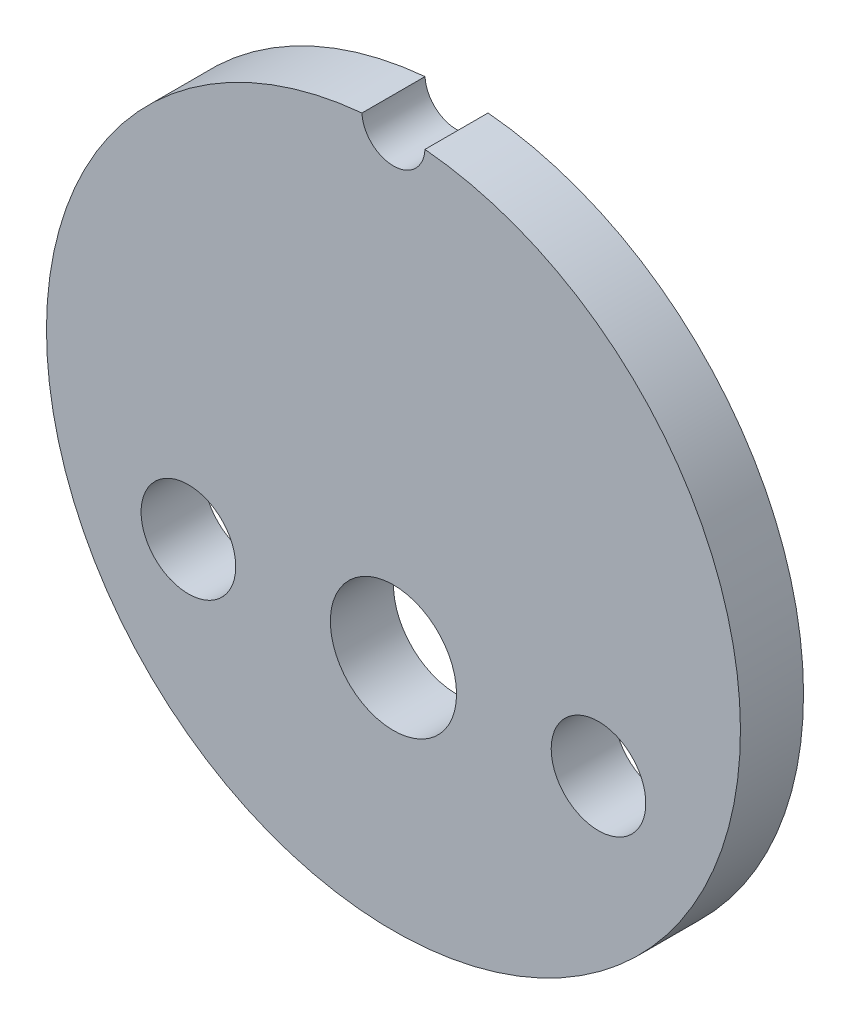
ISO-10303-21;
HEADER;
FILE_DESCRIPTION(('STEP AP214'),'2;1');
FILE_NAME('part.step','',(''),(''),'','','');
FILE_SCHEMA(('AUTOMOTIVE_DESIGN { 1 0 10303 214 1 1 1 1 }'));
ENDSEC;
DATA;
#1=APPLICATION_CONTEXT('core data for automotive mechanical design processes');
#2=APPLICATION_PROTOCOL_DEFINITION('international standard','automotive_design',2000,#1);
#3=PRODUCT_CONTEXT('',#1,'mechanical');
#4=PRODUCT('Part','Part','',(#3));
#5=PRODUCT_RELATED_PRODUCT_CATEGORY('part','',(#4));
#6=PRODUCT_DEFINITION_FORMATION('','',#4);
#7=PRODUCT_DEFINITION_CONTEXT('part definition',#1,'design');
#8=PRODUCT_DEFINITION('design','',#6,#7);
#9=PRODUCT_DEFINITION_SHAPE('','',#8);
#10=(LENGTH_UNIT() NAMED_UNIT(*) SI_UNIT(.MILLI.,.METRE.));
#11=(NAMED_UNIT(*) PLANE_ANGLE_UNIT() SI_UNIT($,.RADIAN.));
#12=(NAMED_UNIT(*) SI_UNIT($,.STERADIAN.) SOLID_ANGLE_UNIT());
#13=UNCERTAINTY_MEASURE_WITH_UNIT(LENGTH_MEASURE(1.E-05),#10,'distance_accuracy_value','');
#14=(GEOMETRIC_REPRESENTATION_CONTEXT(3) GLOBAL_UNCERTAINTY_ASSIGNED_CONTEXT((#13)) GLOBAL_UNIT_ASSIGNED_CONTEXT((#10,
#11,#12)) REPRESENTATION_CONTEXT('',''));
#15=CARTESIAN_POINT('',(0.,0.,0.));
#16=DIRECTION('',(0.,0.,1.));
#17=DIRECTION('',(1.,0.,0.));
#18=AXIS2_PLACEMENT_3D('',#15,#16,#17);
#19=CARTESIAN_POINT('',(-0.589945762939997,5.34282561400124,2.));
#20=DIRECTION('',(0.,0.,1.));
#21=DIRECTION('',(1.,0.,0.));
#22=AXIS2_PLACEMENT_3D('',#19,#20,#21);
#23=PLANE('',#22);
#24=CARTESIAN_POINT('',(-0.589945762939997,16.3428256140012,2.));
#25=DIRECTION('',(0.,0.,1.));
#26=DIRECTION('',(1.,0.,0.));
#27=AXIS2_PLACEMENT_3D('',#24,#25,#26);
#28=CIRCLE('',#27,1.);
#29=CARTESIAN_POINT('',(-1.58891217093254,16.2973710685467,2.));
#30=VERTEX_POINT('',#29);
#31=CARTESIAN_POINT('',(0.409020645052558,16.2973710685467,2.));
#32=VERTEX_POINT('',#31);
#33=EDGE_CURVE('E59',#30,#32,#28,.T.);
#34=ORIENTED_EDGE('',*,*,#33,.F.);
#35=CARTESIAN_POINT('',(-0.589945762939997,5.34282561400124,2.));
#36=DIRECTION('',(0.,0.,1.));
#37=DIRECTION('',(1.,0.,0.));
#38=AXIS2_PLACEMENT_3D('',#35,#36,#37);
#39=CIRCLE('',#38,11.);
#40=EDGE_CURVE('E76',#30,#32,#39,.T.);
#41=ORIENTED_EDGE('',*,*,#40,.T.);
#42=EDGE_LOOP('',(#34,#41));
#43=FACE_BOUND('',#42,.T.);
#44=CARTESIAN_POINT('',(5.91005423706,1.84282561400124,2.));
#45=DIRECTION('',(0.,0.,1.));
#46=DIRECTION('',(-1.,0.,0.));
#47=AXIS2_PLACEMENT_3D('',#44,#45,#46);
#48=CIRCLE('',#47,1.5);
#49=CARTESIAN_POINT('',(4.41005423706,1.84282561400124,2.));
#50=VERTEX_POINT('',#49);
#51=EDGE_CURVE('E89',#50,#50,#48,.T.);
#52=ORIENTED_EDGE('',*,*,#51,.F.);
#53=EDGE_LOOP('',(#52));
#54=FACE_BOUND('',#53,.T.);
#55=CARTESIAN_POINT('',(-7.08994576294,1.84282561400124,2.));
#56=DIRECTION('',(0.,0.,1.));
#57=DIRECTION('',(1.,0.,0.));
#58=AXIS2_PLACEMENT_3D('',#55,#56,#57);
#59=CIRCLE('',#58,1.5);
#60=CARTESIAN_POINT('',(-5.58994576294,1.84282561400124,2.));
#61=VERTEX_POINT('',#60);
#62=EDGE_CURVE('E77',#61,#61,#59,.T.);
#63=ORIENTED_EDGE('',*,*,#62,.F.);
#64=EDGE_LOOP('',(#63));
#65=FACE_BOUND('',#64,.T.);
#66=CARTESIAN_POINT('',(-0.589945762939997,1.84282561400124,2.));
#67=DIRECTION('',(0.,0.,1.));
#68=DIRECTION('',(1.,0.,0.));
#69=AXIS2_PLACEMENT_3D('',#66,#67,#68);
#70=CIRCLE('',#69,2.);
#71=CARTESIAN_POINT('',(1.41005423706,1.84282561400124,2.));
#72=VERTEX_POINT('',#71);
#73=EDGE_CURVE('E95',#72,#72,#70,.T.);
#74=ORIENTED_EDGE('',*,*,#73,.F.);
#75=EDGE_LOOP('',(#74));
#76=FACE_BOUND('',#75,.T.);
#77=ADVANCED_FACE('F38',(#43,#54,#65,#76),#23,.T.);
#78=CARTESIAN_POINT('',(-0.589945762939997,5.34282561400124,0.));
#79=DIRECTION('',(0.,0.,1.));
#80=DIRECTION('',(1.,0.,0.));
#81=AXIS2_PLACEMENT_3D('',#78,#79,#80);
#82=PLANE('',#81);
#83=CARTESIAN_POINT('',(-0.589945762939997,5.34282561400124,0.));
#84=DIRECTION('',(0.,0.,1.));
#85=DIRECTION('',(1.,0.,0.));
#86=AXIS2_PLACEMENT_3D('',#83,#84,#85);
#87=CIRCLE('',#86,11.);
#88=CARTESIAN_POINT('',(-1.58891217093254,16.2973710685467,0.));
#89=VERTEX_POINT('',#88);
#90=CARTESIAN_POINT('',(0.409020645052544,16.2973710685467,0.));
#91=VERTEX_POINT('',#90);
#92=EDGE_CURVE('E72',#89,#91,#87,.T.);
#93=ORIENTED_EDGE('',*,*,#92,.F.);
#94=CARTESIAN_POINT('',(-0.589945762939997,16.3428256140012,0.));
#95=DIRECTION('',(0.,0.,-1.));
#96=DIRECTION('',(-1.,0.,0.));
#97=AXIS2_PLACEMENT_3D('',#94,#95,#96);
#98=CIRCLE('',#97,1.);
#99=EDGE_CURVE('E54',#91,#89,#98,.T.);
#100=ORIENTED_EDGE('',*,*,#99,.F.);
#101=EDGE_LOOP('',(#93,#100));
#102=FACE_BOUND('',#101,.T.);
#103=CARTESIAN_POINT('',(-7.08994576294,1.84282561400124,0.));
#104=DIRECTION('',(0.,0.,1.));
#105=DIRECTION('',(1.,0.,0.));
#106=AXIS2_PLACEMENT_3D('',#103,#104,#105);
#107=CIRCLE('',#106,1.5);
#108=CARTESIAN_POINT('',(-5.58994576294,1.84282561400124,0.));
#109=VERTEX_POINT('',#108);
#110=EDGE_CURVE('E83',#109,#109,#107,.T.);
#111=ORIENTED_EDGE('',*,*,#110,.T.);
#112=EDGE_LOOP('',(#111));
#113=FACE_BOUND('',#112,.T.);
#114=CARTESIAN_POINT('',(5.91005423706,1.84282561400124,0.));
#115=DIRECTION('',(0.,0.,1.));
#116=DIRECTION('',(-1.,0.,0.));
#117=AXIS2_PLACEMENT_3D('',#114,#115,#116);
#118=CIRCLE('',#117,1.5);
#119=CARTESIAN_POINT('',(4.41005423706,1.84282561400124,0.));
#120=VERTEX_POINT('',#119);
#121=EDGE_CURVE('E91',#120,#120,#118,.T.);
#122=ORIENTED_EDGE('',*,*,#121,.T.);
#123=EDGE_LOOP('',(#122));
#124=FACE_BOUND('',#123,.T.);
#125=CARTESIAN_POINT('',(-0.589945762939997,1.84282561400124,0.));
#126=DIRECTION('',(0.,0.,1.));
#127=DIRECTION('',(1.,0.,0.));
#128=AXIS2_PLACEMENT_3D('',#125,#126,#127);
#129=CIRCLE('',#128,2.);
#130=CARTESIAN_POINT('',(1.41005423706,1.84282561400124,0.));
#131=VERTEX_POINT('',#130);
#132=EDGE_CURVE('E99',#131,#131,#129,.T.);
#133=ORIENTED_EDGE('',*,*,#132,.T.);
#134=EDGE_LOOP('',(#133));
#135=FACE_BOUND('',#134,.T.);
#136=ADVANCED_FACE('F70',(#102,#113,#124,#135),#82,.F.);
#137=CARTESIAN_POINT('',(-0.589945762939997,5.34282561400124,2.));
#138=DIRECTION('',(0.,0.,-1.));
#139=DIRECTION('',(-1.,0.,0.));
#140=AXIS2_PLACEMENT_3D('',#137,#138,#139);
#141=CYLINDRICAL_SURFACE('',#140,11.);
#142=ORIENTED_EDGE('',*,*,#92,.T.);
#143=DIRECTION('',(0.,0.,-1.));
#144=VECTOR('',#143,1.);
#145=CARTESIAN_POINT('',(0.409020645052545,16.2973710685467,5.));
#146=LINE('',#145,#144);
#147=EDGE_CURVE('E11',#91,#32,#146,.F.);
#148=ORIENTED_EDGE('',*,*,#147,.T.);
#149=ORIENTED_EDGE('',*,*,#40,.F.);
#150=DIRECTION('',(0.,0.,-1.));
#151=VECTOR('',#150,1.);
#152=CARTESIAN_POINT('',(-1.58891217093254,16.2973710685467,5.));
#153=LINE('',#152,#151);
#154=EDGE_CURVE('E47',#30,#89,#153,.T.);
#155=ORIENTED_EDGE('',*,*,#154,.T.);
#156=EDGE_LOOP('',(#142,#148,#149,#155));
#157=FACE_BOUND('',#156,.T.);
#158=ADVANCED_FACE('F40',(#157),#141,.T.);
#159=CARTESIAN_POINT('',(-7.08994576294,1.84282561400124,2.));
#160=DIRECTION('',(0.,0.,-1.));
#161=DIRECTION('',(-1.,0.,0.));
#162=AXIS2_PLACEMENT_3D('',#159,#160,#161);
#163=CYLINDRICAL_SURFACE('',#162,1.5);
#164=ORIENTED_EDGE('',*,*,#62,.T.);
#165=EDGE_LOOP('',(#164));
#166=FACE_BOUND('',#165,.T.);
#167=ORIENTED_EDGE('',*,*,#110,.F.);
#168=EDGE_LOOP('',(#167));
#169=FACE_BOUND('',#168,.T.);
#170=ADVANCED_FACE('F121',(#166,#169),#163,.F.);
#171=CARTESIAN_POINT('',(5.91005423706,1.84282561400124,2.));
#172=DIRECTION('',(0.,0.,-1.));
#173=DIRECTION('',(-1.,0.,0.));
#174=AXIS2_PLACEMENT_3D('',#171,#172,#173);
#175=CYLINDRICAL_SURFACE('',#174,1.5);
#176=ORIENTED_EDGE('',*,*,#51,.T.);
#177=EDGE_LOOP('',(#176));
#178=FACE_BOUND('',#177,.T.);
#179=ORIENTED_EDGE('',*,*,#121,.F.);
#180=EDGE_LOOP('',(#179));
#181=FACE_BOUND('',#180,.T.);
#182=ADVANCED_FACE('F124',(#178,#181),#175,.F.);
#183=CARTESIAN_POINT('',(-0.589945762939997,1.84282561400124,2.));
#184=DIRECTION('',(0.,0.,-1.));
#185=DIRECTION('',(-1.,0.,0.));
#186=AXIS2_PLACEMENT_3D('',#183,#184,#185);
#187=CYLINDRICAL_SURFACE('',#186,2.);
#188=ORIENTED_EDGE('',*,*,#73,.T.);
#189=EDGE_LOOP('',(#188));
#190=FACE_BOUND('',#189,.T.);
#191=ORIENTED_EDGE('',*,*,#132,.F.);
#192=EDGE_LOOP('',(#191));
#193=FACE_BOUND('',#192,.T.);
#194=ADVANCED_FACE('F109',(#190,#193),#187,.F.);
#195=CARTESIAN_POINT('',(-0.589945762939997,16.3428256140012,10.));
#196=DIRECTION('',(0.,0.,-1.));
#197=DIRECTION('',(-1.,0.,0.));
#198=AXIS2_PLACEMENT_3D('',#195,#196,#197);
#199=CYLINDRICAL_SURFACE('',#198,1.);
#200=ORIENTED_EDGE('',*,*,#99,.T.);
#201=ORIENTED_EDGE('',*,*,#154,.F.);
#202=ORIENTED_EDGE('',*,*,#33,.T.);
#203=ORIENTED_EDGE('',*,*,#147,.F.);
#204=EDGE_LOOP('',(#200,#201,#202,#203));
#205=FACE_BOUND('',#204,.T.);
#206=ADVANCED_FACE('F63',(#205),#199,.F.);
#207=CLOSED_SHELL('',(#77,#136,#158,#170,#182,#194,#206));
#208=MANIFOLD_SOLID_BREP('B2',#207);
#209=ADVANCED_BREP_SHAPE_REPRESENTATION('',(#18,#208),#14);
#210=SHAPE_DEFINITION_REPRESENTATION(#9,#209);
ENDSEC;
END-ISO-10303-21;
